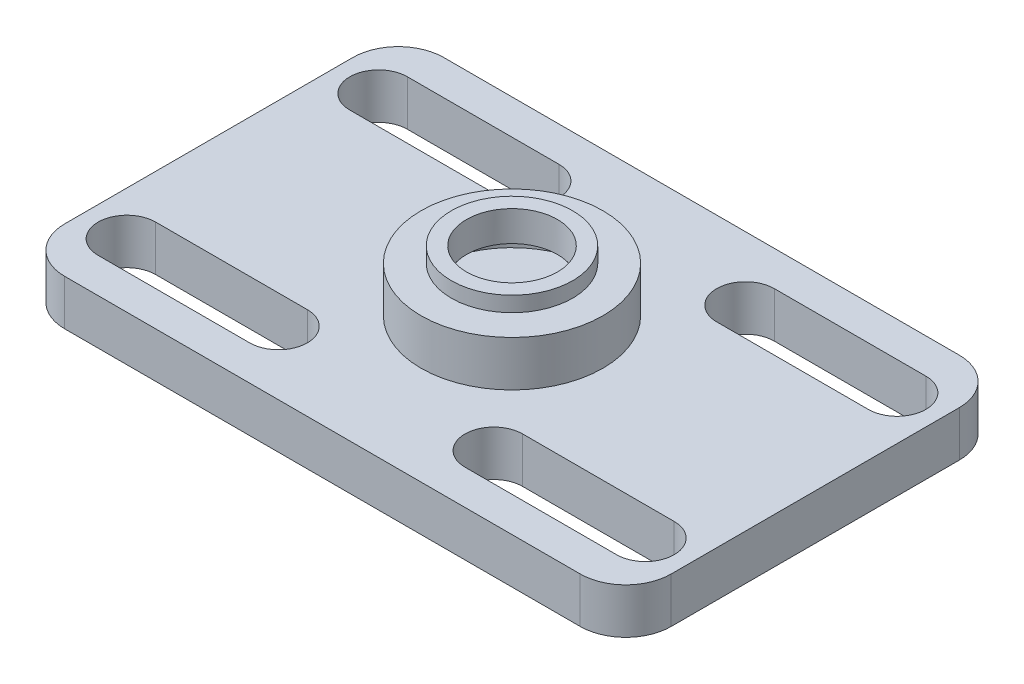
ISO-10303-21;
HEADER;
FILE_DESCRIPTION(('STEP AP214'),'2;1');
FILE_NAME('part.step','',(''),(''),'','','');
FILE_SCHEMA(('AUTOMOTIVE_DESIGN { 1 0 10303 214 1 1 1 1 }'));
ENDSEC;
DATA;
#1=APPLICATION_CONTEXT('core data for automotive mechanical design processes');
#2=APPLICATION_PROTOCOL_DEFINITION('international standard','automotive_design',2000,#1);
#3=PRODUCT_CONTEXT('',#1,'mechanical');
#4=PRODUCT('Part','Part','',(#3));
#5=PRODUCT_RELATED_PRODUCT_CATEGORY('part','',(#4));
#6=PRODUCT_DEFINITION_FORMATION('','',#4);
#7=PRODUCT_DEFINITION_CONTEXT('part definition',#1,'design');
#8=PRODUCT_DEFINITION('design','',#6,#7);
#9=PRODUCT_DEFINITION_SHAPE('','',#8);
#10=(LENGTH_UNIT() NAMED_UNIT(*) SI_UNIT(.MILLI.,.METRE.));
#11=(NAMED_UNIT(*) PLANE_ANGLE_UNIT() SI_UNIT($,.RADIAN.));
#12=(NAMED_UNIT(*) SI_UNIT($,.STERADIAN.) SOLID_ANGLE_UNIT());
#13=UNCERTAINTY_MEASURE_WITH_UNIT(LENGTH_MEASURE(1.E-05),#10,'distance_accuracy_value','');
#14=(GEOMETRIC_REPRESENTATION_CONTEXT(3) GLOBAL_UNCERTAINTY_ASSIGNED_CONTEXT((#13)) GLOBAL_UNIT_ASSIGNED_CONTEXT((#10,
#11,#12)) REPRESENTATION_CONTEXT('',''));
#15=CARTESIAN_POINT('',(0.,0.,0.));
#16=DIRECTION('',(0.,0.,1.));
#17=DIRECTION('',(1.,0.,0.));
#18=AXIS2_PLACEMENT_3D('',#15,#16,#17);
#19=CARTESIAN_POINT('',(0.,-5.,0.));
#20=DIRECTION('',(0.,1.,0.));
#21=DIRECTION('',(0.,0.,1.));
#22=AXIS2_PLACEMENT_3D('',#19,#20,#21);
#23=CYLINDRICAL_SURFACE('',#22,15.);
#24=CARTESIAN_POINT('',(0.,0.,0.));
#25=DIRECTION('',(0.,1.,0.));
#26=DIRECTION('',(0.,0.,1.));
#27=AXIS2_PLACEMENT_3D('',#24,#25,#26);
#28=CIRCLE('',#27,15.);
#29=CARTESIAN_POINT('',(0.,0.,15.));
#30=VERTEX_POINT('',#29);
#31=EDGE_CURVE('E367',#30,#30,#28,.T.);
#32=ORIENTED_EDGE('',*,*,#31,.T.);
#33=EDGE_LOOP('',(#32));
#34=FACE_BOUND('',#33,.T.);
#35=CARTESIAN_POINT('',(0.,-10.,0.));
#36=DIRECTION('',(0.,-1.,0.));
#37=DIRECTION('',(0.,0.,-1.));
#38=AXIS2_PLACEMENT_3D('',#35,#36,#37);
#39=CIRCLE('',#38,15.);
#40=CARTESIAN_POINT('',(0.,-10.,-15.));
#41=VERTEX_POINT('',#40);
#42=EDGE_CURVE('E359',#41,#41,#39,.F.);
#43=ORIENTED_EDGE('',*,*,#42,.F.);
#44=EDGE_LOOP('',(#43));
#45=FACE_BOUND('',#44,.T.);
#46=ADVANCED_FACE('F34',(#34,#45),#23,.F.);
#47=CARTESIAN_POINT('',(0.,-5.,0.));
#48=DIRECTION('',(0.,1.,0.));
#49=DIRECTION('',(0.,0.,1.));
#50=AXIS2_PLACEMENT_3D('',#47,#48,#49);
#51=CYLINDRICAL_SURFACE('',#50,20.);
#52=CARTESIAN_POINT('',(0.,-5.,0.));
#53=DIRECTION('',(0.,1.,0.));
#54=DIRECTION('',(0.,0.,1.));
#55=AXIS2_PLACEMENT_3D('',#52,#53,#54);
#56=CIRCLE('',#55,20.);
#57=CARTESIAN_POINT('',(0.,-5.,20.));
#58=VERTEX_POINT('',#57);
#59=EDGE_CURVE('E363',#58,#58,#56,.T.);
#60=ORIENTED_EDGE('',*,*,#59,.T.);
#61=EDGE_LOOP('',(#60));
#62=FACE_BOUND('',#61,.T.);
#63=CARTESIAN_POINT('',(0.,0.,0.));
#64=DIRECTION('',(0.,1.,0.));
#65=DIRECTION('',(0.,0.,1.));
#66=AXIS2_PLACEMENT_3D('',#63,#64,#65);
#67=CIRCLE('',#66,20.);
#68=CARTESIAN_POINT('',(0.,0.,20.));
#69=VERTEX_POINT('',#68);
#70=EDGE_CURVE('E370',#69,#69,#67,.T.);
#71=ORIENTED_EDGE('',*,*,#70,.F.);
#72=EDGE_LOOP('',(#71));
#73=FACE_BOUND('',#72,.T.);
#74=ADVANCED_FACE('F447',(#62,#73),#51,.T.);
#75=CARTESIAN_POINT('',(0.,0.,0.));
#76=DIRECTION('',(0.,1.,0.));
#77=DIRECTION('',(0.,0.,1.));
#78=AXIS2_PLACEMENT_3D('',#75,#76,#77);
#79=PLANE('',#78);
#80=ORIENTED_EDGE('',*,*,#31,.F.);
#81=EDGE_LOOP('',(#80));
#82=FACE_BOUND('',#81,.T.);
#83=ORIENTED_EDGE('',*,*,#70,.T.);
#84=EDGE_LOOP('',(#83));
#85=FACE_BOUND('',#84,.T.);
#86=ADVANCED_FACE('F453',(#82,#85),#79,.T.);
#87=CARTESIAN_POINT('',(0.,-5.,0.));
#88=DIRECTION('',(0.,-1.,0.));
#89=DIRECTION('',(0.,0.,-1.));
#90=AXIS2_PLACEMENT_3D('',#87,#88,#89);
#91=PLANE('',#90);
#92=ORIENTED_EDGE('',*,*,#59,.F.);
#93=EDGE_LOOP('',(#92));
#94=FACE_BOUND('',#93,.T.);
#95=CARTESIAN_POINT('',(0.,-5.,0.));
#96=DIRECTION('',(0.,-1.,0.));
#97=DIRECTION('',(0.,0.,-1.));
#98=AXIS2_PLACEMENT_3D('',#95,#96,#97);
#99=CIRCLE('',#98,30.);
#100=CARTESIAN_POINT('',(0.,-5.,-30.));
#101=VERTEX_POINT('',#100);
#102=EDGE_CURVE('E364',#101,#101,#99,.T.);
#103=ORIENTED_EDGE('',*,*,#102,.F.);
#104=EDGE_LOOP('',(#103));
#105=FACE_BOUND('',#104,.T.);
#106=ADVANCED_FACE('F462',(#94,#105),#91,.F.);
#107=CARTESIAN_POINT('',(0.,-20.,0.));
#108=DIRECTION('',(0.,1.,0.));
#109=DIRECTION('',(0.,0.,1.));
#110=AXIS2_PLACEMENT_3D('',#107,#108,#109);
#111=CYLINDRICAL_SURFACE('',#110,30.);
#112=CARTESIAN_POINT('',(0.,-20.,0.));
#113=DIRECTION('',(0.,-1.,0.));
#114=DIRECTION('',(0.,0.,-1.));
#115=AXIS2_PLACEMENT_3D('',#112,#113,#114);
#116=CIRCLE('',#115,30.);
#117=CARTESIAN_POINT('',(0.,-20.,-30.));
#118=VERTEX_POINT('',#117);
#119=EDGE_CURVE('E360',#118,#118,#116,.T.);
#120=ORIENTED_EDGE('',*,*,#119,.F.);
#121=EDGE_LOOP('',(#120));
#122=FACE_BOUND('',#121,.T.);
#123=ORIENTED_EDGE('',*,*,#102,.T.);
#124=EDGE_LOOP('',(#123));
#125=FACE_BOUND('',#124,.T.);
#126=ADVANCED_FACE('F459',(#122,#125),#111,.T.);
#127=CARTESIAN_POINT('',(0.,-10.,0.));
#128=DIRECTION('',(0.,-1.,0.));
#129=DIRECTION('',(0.,0.,-1.));
#130=AXIS2_PLACEMENT_3D('',#127,#128,#129);
#131=PLANE('',#130);
#132=CARTESIAN_POINT('',(0.,-9.99999999999999,0.));
#133=DIRECTION('',(0.,-1.,0.));
#134=DIRECTION('',(0.,0.,-1.));
#135=AXIS2_PLACEMENT_3D('',#132,#133,#134);
#136=CIRCLE('',#135,27.5);
#137=CARTESIAN_POINT('',(0.,-9.99999999999999,-27.5));
#138=VERTEX_POINT('',#137);
#139=EDGE_CURVE('E356',#138,#138,#136,.F.);
#140=ORIENTED_EDGE('',*,*,#139,.F.);
#141=EDGE_LOOP('',(#140));
#142=FACE_BOUND('',#141,.T.);
#143=ORIENTED_EDGE('',*,*,#42,.T.);
#144=EDGE_LOOP('',(#143));
#145=FACE_BOUND('',#144,.T.);
#146=ADVANCED_FACE('F489',(#142,#145),#131,.T.);
#147=CARTESIAN_POINT('',(0.,72.7817459305202,0.));
#148=DIRECTION('',(0.,-1.,0.));
#149=DIRECTION('',(0.,0.,-1.));
#150=AXIS2_PLACEMENT_3D('',#147,#148,#149);
#151=CYLINDRICAL_SURFACE('',#150,27.5);
#152=ORIENTED_EDGE('',*,*,#139,.T.);
#153=EDGE_LOOP('',(#152));
#154=FACE_BOUND('',#153,.T.);
#155=CARTESIAN_POINT('',(0.,-20.,0.));
#156=DIRECTION('',(0.,-1.,0.));
#157=DIRECTION('',(0.,0.,-1.));
#158=AXIS2_PLACEMENT_3D('',#155,#156,#157);
#159=CIRCLE('',#158,27.5);
#160=CARTESIAN_POINT('',(0.,-20.,-27.5));
#161=VERTEX_POINT('',#160);
#162=EDGE_CURVE('E344',#161,#161,#159,.T.);
#163=ORIENTED_EDGE('',*,*,#162,.T.);
#164=EDGE_LOOP('',(#163));
#165=FACE_BOUND('',#164,.T.);
#166=ADVANCED_FACE('F498',(#154,#165),#151,.F.);
#167=CARTESIAN_POINT('',(85.5000000000003,-35.,-50.9999999999993));
#168=DIRECTION('',(0.,0.,1.));
#169=DIRECTION('',(1.,0.,0.));
#170=AXIS2_PLACEMENT_3D('',#167,#168,#169);
#171=PLANE('',#170);
#172=DIRECTION('',(1.,0.,0.));
#173=VECTOR('',#172,1.);
#174=CARTESIAN_POINT('',(85.5000000000003,-20.,-50.9999999999993));
#175=LINE('',#174,#173);
#176=CARTESIAN_POINT('',(35.5000000000003,-20.,-50.9999999999998));
#177=VERTEX_POINT('',#176);
#178=CARTESIAN_POINT('',(85.5000000000003,-20.,-50.9999999999993));
#179=VERTEX_POINT('',#178);
#180=EDGE_CURVE('E209',#177,#179,#175,.T.);
#181=ORIENTED_EDGE('',*,*,#180,.F.);
#182=DIRECTION('',(0.,1.,0.));
#183=VECTOR('',#182,1.);
#184=CARTESIAN_POINT('',(35.5000000000003,-35.,-50.9999999999998));
#185=LINE('',#184,#183);
#186=CARTESIAN_POINT('',(35.5000000000003,-35.,-50.9999999999998));
#187=VERTEX_POINT('',#186);
#188=EDGE_CURVE('E237',#187,#177,#185,.T.);
#189=ORIENTED_EDGE('',*,*,#188,.F.);
#190=DIRECTION('',(1.,0.,0.));
#191=VECTOR('',#190,1.);
#192=CARTESIAN_POINT('',(85.5000000000003,-35.,-50.9999999999993));
#193=LINE('',#192,#191);
#194=CARTESIAN_POINT('',(85.5000000000003,-35.,-50.9999999999993));
#195=VERTEX_POINT('',#194);
#196=EDGE_CURVE('E224',#187,#195,#193,.T.);
#197=ORIENTED_EDGE('',*,*,#196,.T.);
#198=DIRECTION('',(0.,1.,0.));
#199=VECTOR('',#198,1.);
#200=CARTESIAN_POINT('',(85.5000000000003,-35.,-50.9999999999993));
#201=LINE('',#200,#199);
#202=EDGE_CURVE('E204',#195,#179,#201,.T.);
#203=ORIENTED_EDGE('',*,*,#202,.T.);
#204=EDGE_LOOP('',(#181,#189,#197,#203));
#205=FACE_BOUND('',#204,.T.);
#206=ADVANCED_FACE('F501',(#205),#171,.T.);
#207=CARTESIAN_POINT('',(35.5000000000003,-35.,-41.4999999999998));
#208=DIRECTION('',(0.,1.,0.));
#209=DIRECTION('',(0.,0.,1.));
#210=AXIS2_PLACEMENT_3D('',#207,#208,#209);
#211=CYLINDRICAL_SURFACE('',#210,9.49999999999997);
#212=CARTESIAN_POINT('',(35.5000000000003,-20.,-41.4999999999998));
#213=DIRECTION('',(0.,-1.,0.));
#214=DIRECTION('',(0.,0.,-1.));
#215=AXIS2_PLACEMENT_3D('',#212,#213,#214);
#216=CIRCLE('',#215,9.49999999999997);
#217=CARTESIAN_POINT('',(35.5000000000002,-20.,-31.9999999999999));
#218=VERTEX_POINT('',#217);
#219=EDGE_CURVE('E231',#218,#177,#216,.T.);
#220=ORIENTED_EDGE('',*,*,#219,.F.);
#221=DIRECTION('',(0.,1.,0.));
#222=VECTOR('',#221,1.);
#223=CARTESIAN_POINT('',(35.5000000000002,-35.,-31.9999999999999));
#224=LINE('',#223,#222);
#225=CARTESIAN_POINT('',(35.5000000000002,-35.,-31.9999999999999));
#226=VERTEX_POINT('',#225);
#227=EDGE_CURVE('E217',#226,#218,#224,.T.);
#228=ORIENTED_EDGE('',*,*,#227,.F.);
#229=CARTESIAN_POINT('',(35.5000000000003,-35.,-41.4999999999998));
#230=DIRECTION('',(0.,-1.,0.));
#231=DIRECTION('',(0.,0.,-1.));
#232=AXIS2_PLACEMENT_3D('',#229,#230,#231);
#233=CIRCLE('',#232,9.49999999999997);
#234=EDGE_CURVE('E222',#226,#187,#233,.T.);
#235=ORIENTED_EDGE('',*,*,#234,.T.);
#236=ORIENTED_EDGE('',*,*,#188,.T.);
#237=EDGE_LOOP('',(#220,#228,#235,#236));
#238=FACE_BOUND('',#237,.T.);
#239=ADVANCED_FACE('F567',(#238),#211,.F.);
#240=CARTESIAN_POINT('',(85.5000000000002,-35.,-31.9999999999994));
#241=DIRECTION('',(0.,0.,-1.));
#242=DIRECTION('',(-1.,0.,0.));
#243=AXIS2_PLACEMENT_3D('',#240,#241,#242);
#244=PLANE('',#243);
#245=DIRECTION('',(-1.,0.,0.));
#246=VECTOR('',#245,1.);
#247=CARTESIAN_POINT('',(85.5000000000002,-20.,-31.9999999999994));
#248=LINE('',#247,#246);
#249=CARTESIAN_POINT('',(85.5000000000002,-20.,-31.9999999999994));
#250=VERTEX_POINT('',#249);
#251=EDGE_CURVE('E215',#250,#218,#248,.T.);
#252=ORIENTED_EDGE('',*,*,#251,.F.);
#253=DIRECTION('',(0.,1.,0.));
#254=VECTOR('',#253,1.);
#255=CARTESIAN_POINT('',(85.5000000000002,-35.,-31.9999999999994));
#256=LINE('',#255,#254);
#257=CARTESIAN_POINT('',(85.5000000000002,-35.,-31.9999999999994));
#258=VERTEX_POINT('',#257);
#259=EDGE_CURVE('E201',#258,#250,#256,.T.);
#260=ORIENTED_EDGE('',*,*,#259,.F.);
#261=DIRECTION('',(-1.,0.,0.));
#262=VECTOR('',#261,1.);
#263=CARTESIAN_POINT('',(85.5000000000002,-35.,-31.9999999999994));
#264=LINE('',#263,#262);
#265=EDGE_CURVE('E208',#258,#226,#264,.T.);
#266=ORIENTED_EDGE('',*,*,#265,.T.);
#267=ORIENTED_EDGE('',*,*,#227,.T.);
#268=EDGE_LOOP('',(#252,#260,#266,#267));
#269=FACE_BOUND('',#268,.T.);
#270=ADVANCED_FACE('F212',(#269),#244,.T.);
#271=CARTESIAN_POINT('',(85.5000000000003,-35.,-41.4999999999994));
#272=DIRECTION('',(0.,1.,0.));
#273=DIRECTION('',(0.,0.,1.));
#274=AXIS2_PLACEMENT_3D('',#271,#272,#273);
#275=CYLINDRICAL_SURFACE('',#274,9.49999999999997);
#276=CARTESIAN_POINT('',(85.5000000000003,-20.,-41.4999999999994));
#277=DIRECTION('',(0.,-1.,0.));
#278=DIRECTION('',(0.,0.,-1.));
#279=AXIS2_PLACEMENT_3D('',#276,#277,#278);
#280=CIRCLE('',#279,9.49999999999997);
#281=EDGE_CURVE('E228',#179,#250,#280,.T.);
#282=ORIENTED_EDGE('',*,*,#281,.F.);
#283=ORIENTED_EDGE('',*,*,#202,.F.);
#284=CARTESIAN_POINT('',(85.5000000000003,-35.,-41.4999999999994));
#285=DIRECTION('',(0.,-1.,0.));
#286=DIRECTION('',(0.,0.,-1.));
#287=AXIS2_PLACEMENT_3D('',#284,#285,#286);
#288=CIRCLE('',#287,9.49999999999997);
#289=EDGE_CURVE('E198',#195,#258,#288,.T.);
#290=ORIENTED_EDGE('',*,*,#289,.T.);
#291=ORIENTED_EDGE('',*,*,#259,.T.);
#292=EDGE_LOOP('',(#282,#283,#290,#291));
#293=FACE_BOUND('',#292,.T.);
#294=ADVANCED_FACE('F200',(#293),#275,.F.);
#295=CARTESIAN_POINT('',(85.4999999999998,-35.,32.0000000000005));
#296=DIRECTION('',(0.,0.,1.));
#297=DIRECTION('',(1.,0.,0.));
#298=AXIS2_PLACEMENT_3D('',#295,#296,#297);
#299=PLANE('',#298);
#300=DIRECTION('',(1.,0.,0.));
#301=VECTOR('',#300,1.);
#302=CARTESIAN_POINT('',(85.4999999999998,-20.,32.0000000000005));
#303=LINE('',#302,#301);
#304=CARTESIAN_POINT('',(35.4999999999998,-20.,32.0000000000005));
#305=VERTEX_POINT('',#304);
#306=CARTESIAN_POINT('',(85.4999999999998,-20.,32.0000000000005));
#307=VERTEX_POINT('',#306);
#308=EDGE_CURVE('E243',#305,#307,#303,.T.);
#309=ORIENTED_EDGE('',*,*,#308,.F.);
#310=DIRECTION('',(0.,1.,0.));
#311=VECTOR('',#310,1.);
#312=CARTESIAN_POINT('',(35.4999999999998,-35.,32.0000000000005));
#313=LINE('',#312,#311);
#314=CARTESIAN_POINT('',(35.4999999999998,-35.,32.0000000000005));
#315=VERTEX_POINT('',#314);
#316=EDGE_CURVE('E263',#315,#305,#313,.T.);
#317=ORIENTED_EDGE('',*,*,#316,.F.);
#318=DIRECTION('',(1.,0.,0.));
#319=VECTOR('',#318,1.);
#320=CARTESIAN_POINT('',(85.4999999999998,-35.,32.0000000000005));
#321=LINE('',#320,#319);
#322=CARTESIAN_POINT('',(85.4999999999998,-35.,32.0000000000005));
#323=VERTEX_POINT('',#322);
#324=EDGE_CURVE('E248',#315,#323,#321,.T.);
#325=ORIENTED_EDGE('',*,*,#324,.T.);
#326=DIRECTION('',(0.,1.,0.));
#327=VECTOR('',#326,1.);
#328=CARTESIAN_POINT('',(85.4999999999998,-35.,32.0000000000005));
#329=LINE('',#328,#327);
#330=EDGE_CURVE('E250',#323,#307,#329,.T.);
#331=ORIENTED_EDGE('',*,*,#330,.T.);
#332=EDGE_LOOP('',(#309,#317,#325,#331));
#333=FACE_BOUND('',#332,.T.);
#334=ADVANCED_FACE('F558',(#333),#299,.T.);
#335=CARTESIAN_POINT('',(35.4999999999997,-35.,41.5000000000005));
#336=DIRECTION('',(0.,1.,0.));
#337=DIRECTION('',(0.,0.,1.));
#338=AXIS2_PLACEMENT_3D('',#335,#336,#337);
#339=CYLINDRICAL_SURFACE('',#338,9.49999999999997);
#340=CARTESIAN_POINT('',(35.4999999999997,-20.,41.5000000000005));
#341=DIRECTION('',(0.,-1.,0.));
#342=DIRECTION('',(0.,0.,1.));
#343=AXIS2_PLACEMENT_3D('',#340,#341,#342);
#344=CIRCLE('',#343,9.49999999999997);
#345=CARTESIAN_POINT('',(35.4999999999996,-20.,51.0000000000004));
#346=VERTEX_POINT('',#345);
#347=EDGE_CURVE('E256',#346,#305,#344,.T.);
#348=ORIENTED_EDGE('',*,*,#347,.F.);
#349=DIRECTION('',(0.,1.,0.));
#350=VECTOR('',#349,1.);
#351=CARTESIAN_POINT('',(35.4999999999996,-35.,51.0000000000004));
#352=LINE('',#351,#350);
#353=CARTESIAN_POINT('',(35.4999999999996,-35.,51.0000000000004));
#354=VERTEX_POINT('',#353);
#355=EDGE_CURVE('E265',#354,#346,#352,.T.);
#356=ORIENTED_EDGE('',*,*,#355,.F.);
#357=CARTESIAN_POINT('',(35.4999999999997,-35.,41.5000000000005));
#358=DIRECTION('',(0.,-1.,0.));
#359=DIRECTION('',(0.,0.,1.));
#360=AXIS2_PLACEMENT_3D('',#357,#358,#359);
#361=CIRCLE('',#360,9.49999999999997);
#362=EDGE_CURVE('E245',#354,#315,#361,.T.);
#363=ORIENTED_EDGE('',*,*,#362,.T.);
#364=ORIENTED_EDGE('',*,*,#316,.T.);
#365=EDGE_LOOP('',(#348,#356,#363,#364));
#366=FACE_BOUND('',#365,.T.);
#367=ADVANCED_FACE('F554',(#366),#339,.F.);
#368=CARTESIAN_POINT('',(85.4999999999996,-35.,51.0000000000004));
#369=DIRECTION('',(0.,0.,-1.));
#370=DIRECTION('',(-1.,0.,0.));
#371=AXIS2_PLACEMENT_3D('',#368,#369,#370);
#372=PLANE('',#371);
#373=DIRECTION('',(-1.,0.,0.));
#374=VECTOR('',#373,1.);
#375=CARTESIAN_POINT('',(85.4999999999996,-20.,51.0000000000004));
#376=LINE('',#375,#374);
#377=CARTESIAN_POINT('',(85.4999999999996,-20.,51.0000000000004));
#378=VERTEX_POINT('',#377);
#379=EDGE_CURVE('E253',#378,#346,#376,.T.);
#380=ORIENTED_EDGE('',*,*,#379,.F.);
#381=DIRECTION('',(0.,1.,0.));
#382=VECTOR('',#381,1.);
#383=CARTESIAN_POINT('',(85.4999999999996,-35.,51.0000000000004));
#384=LINE('',#383,#382);
#385=CARTESIAN_POINT('',(85.4999999999996,-35.,51.0000000000004));
#386=VERTEX_POINT('',#385);
#387=EDGE_CURVE('E267',#386,#378,#384,.T.);
#388=ORIENTED_EDGE('',*,*,#387,.F.);
#389=DIRECTION('',(-1.,0.,0.));
#390=VECTOR('',#389,1.);
#391=CARTESIAN_POINT('',(85.4999999999996,-35.,51.0000000000004));
#392=LINE('',#391,#390);
#393=EDGE_CURVE('E242',#386,#354,#392,.T.);
#394=ORIENTED_EDGE('',*,*,#393,.T.);
#395=ORIENTED_EDGE('',*,*,#355,.T.);
#396=EDGE_LOOP('',(#380,#388,#394,#395));
#397=FACE_BOUND('',#396,.T.);
#398=ADVANCED_FACE('F550',(#397),#372,.T.);
#399=CARTESIAN_POINT('',(85.4999999999997,-35.,41.5000000000005));
#400=DIRECTION('',(0.,1.,0.));
#401=DIRECTION('',(0.,0.,1.));
#402=AXIS2_PLACEMENT_3D('',#399,#400,#401);
#403=CYLINDRICAL_SURFACE('',#402,9.49999999999997);
#404=CARTESIAN_POINT('',(85.4999999999997,-20.,41.5000000000005));
#405=DIRECTION('',(0.,-1.,0.));
#406=DIRECTION('',(0.,0.,1.));
#407=AXIS2_PLACEMENT_3D('',#404,#405,#406);
#408=CIRCLE('',#407,9.49999999999997);
#409=EDGE_CURVE('E216',#307,#378,#408,.T.);
#410=ORIENTED_EDGE('',*,*,#409,.F.);
#411=ORIENTED_EDGE('',*,*,#330,.F.);
#412=CARTESIAN_POINT('',(85.4999999999997,-35.,41.5000000000005));
#413=DIRECTION('',(0.,-1.,0.));
#414=DIRECTION('',(0.,0.,1.));
#415=AXIS2_PLACEMENT_3D('',#412,#413,#414);
#416=CIRCLE('',#415,9.49999999999997);
#417=EDGE_CURVE('E240',#323,#386,#416,.T.);
#418=ORIENTED_EDGE('',*,*,#417,.T.);
#419=ORIENTED_EDGE('',*,*,#387,.T.);
#420=EDGE_LOOP('',(#410,#411,#418,#419));
#421=FACE_BOUND('',#420,.T.);
#422=ADVANCED_FACE('F546',(#421),#403,.F.);
#423=CARTESIAN_POINT('',(-85.5,-35.,-32.));
#424=DIRECTION('',(0.,0.,-1.));
#425=DIRECTION('',(-1.,0.,0.));
#426=AXIS2_PLACEMENT_3D('',#423,#424,#425);
#427=PLANE('',#426);
#428=DIRECTION('',(-1.,0.,0.));
#429=VECTOR('',#428,1.);
#430=CARTESIAN_POINT('',(-85.5,-20.,-32.));
#431=LINE('',#430,#429);
#432=CARTESIAN_POINT('',(-35.5,-20.,-32.0000000000001));
#433=VERTEX_POINT('',#432);
#434=CARTESIAN_POINT('',(-85.5,-20.,-32.));
#435=VERTEX_POINT('',#434);
#436=EDGE_CURVE('E274',#433,#435,#431,.T.);
#437=ORIENTED_EDGE('',*,*,#436,.F.);
#438=DIRECTION('',(0.,1.,0.));
#439=VECTOR('',#438,1.);
#440=CARTESIAN_POINT('',(-35.5,-35.,-32.0000000000001));
#441=LINE('',#440,#439);
#442=CARTESIAN_POINT('',(-35.5,-35.,-32.));
#443=VERTEX_POINT('',#442);
#444=EDGE_CURVE('E294',#443,#433,#441,.T.);
#445=ORIENTED_EDGE('',*,*,#444,.F.);
#446=DIRECTION('',(-1.,0.,0.));
#447=VECTOR('',#446,1.);
#448=CARTESIAN_POINT('',(-85.5,-35.,-32.));
#449=LINE('',#448,#447);
#450=CARTESIAN_POINT('',(-85.5,-35.,-32.));
#451=VERTEX_POINT('',#450);
#452=EDGE_CURVE('E279',#443,#451,#449,.T.);
#453=ORIENTED_EDGE('',*,*,#452,.T.);
#454=DIRECTION('',(0.,1.,0.));
#455=VECTOR('',#454,1.);
#456=CARTESIAN_POINT('',(-85.5,-35.,-32.));
#457=LINE('',#456,#455);
#458=EDGE_CURVE('E281',#451,#435,#457,.T.);
#459=ORIENTED_EDGE('',*,*,#458,.T.);
#460=EDGE_LOOP('',(#437,#445,#453,#459));
#461=FACE_BOUND('',#460,.T.);
#462=ADVANCED_FACE('F542',(#461),#427,.T.);
#463=CARTESIAN_POINT('',(-35.5,-35.,-41.5));
#464=DIRECTION('',(0.,1.,0.));
#465=DIRECTION('',(0.,0.,1.));
#466=AXIS2_PLACEMENT_3D('',#463,#464,#465);
#467=CYLINDRICAL_SURFACE('',#466,9.49999999999997);
#468=CARTESIAN_POINT('',(-35.5,-20.,-41.5));
#469=DIRECTION('',(0.,-1.,0.));
#470=DIRECTION('',(0.,0.,1.));
#471=AXIS2_PLACEMENT_3D('',#468,#469,#470);
#472=CIRCLE('',#471,9.49999999999997);
#473=CARTESIAN_POINT('',(-35.5,-20.,-51.));
#474=VERTEX_POINT('',#473);
#475=EDGE_CURVE('E287',#474,#433,#472,.T.);
#476=ORIENTED_EDGE('',*,*,#475,.F.);
#477=DIRECTION('',(0.,1.,0.));
#478=VECTOR('',#477,1.);
#479=CARTESIAN_POINT('',(-35.5,-35.,-51.));
#480=LINE('',#479,#478);
#481=CARTESIAN_POINT('',(-35.5,-35.,-51.));
#482=VERTEX_POINT('',#481);
#483=EDGE_CURVE('E296',#482,#474,#480,.T.);
#484=ORIENTED_EDGE('',*,*,#483,.F.);
#485=CARTESIAN_POINT('',(-35.5,-35.,-41.5));
#486=DIRECTION('',(0.,-1.,0.));
#487=DIRECTION('',(0.,0.,1.));
#488=AXIS2_PLACEMENT_3D('',#485,#486,#487);
#489=CIRCLE('',#488,9.49999999999997);
#490=EDGE_CURVE('E276',#482,#443,#489,.T.);
#491=ORIENTED_EDGE('',*,*,#490,.T.);
#492=ORIENTED_EDGE('',*,*,#444,.T.);
#493=EDGE_LOOP('',(#476,#484,#491,#492));
#494=FACE_BOUND('',#493,.T.);
#495=ADVANCED_FACE('F538',(#494),#467,.F.);
#496=CARTESIAN_POINT('',(-85.5,-35.,-51.));
#497=DIRECTION('',(0.,0.,1.));
#498=DIRECTION('',(1.,0.,0.));
#499=AXIS2_PLACEMENT_3D('',#496,#497,#498);
#500=PLANE('',#499);
#501=DIRECTION('',(1.,0.,0.));
#502=VECTOR('',#501,1.);
#503=CARTESIAN_POINT('',(-85.5,-20.,-51.));
#504=LINE('',#503,#502);
#505=CARTESIAN_POINT('',(-85.5,-20.,-51.));
#506=VERTEX_POINT('',#505);
#507=EDGE_CURVE('E284',#506,#474,#504,.T.);
#508=ORIENTED_EDGE('',*,*,#507,.F.);
#509=DIRECTION('',(0.,1.,0.));
#510=VECTOR('',#509,1.);
#511=CARTESIAN_POINT('',(-85.5,-35.,-51.));
#512=LINE('',#511,#510);
#513=CARTESIAN_POINT('',(-85.5,-35.,-51.));
#514=VERTEX_POINT('',#513);
#515=EDGE_CURVE('E298',#514,#506,#512,.T.);
#516=ORIENTED_EDGE('',*,*,#515,.F.);
#517=DIRECTION('',(1.,0.,0.));
#518=VECTOR('',#517,1.);
#519=CARTESIAN_POINT('',(-85.5,-35.,-51.));
#520=LINE('',#519,#518);
#521=EDGE_CURVE('E273',#514,#482,#520,.T.);
#522=ORIENTED_EDGE('',*,*,#521,.T.);
#523=ORIENTED_EDGE('',*,*,#483,.T.);
#524=EDGE_LOOP('',(#508,#516,#522,#523));
#525=FACE_BOUND('',#524,.T.);
#526=ADVANCED_FACE('F534',(#525),#500,.T.);
#527=CARTESIAN_POINT('',(-85.5,-35.,-41.5));
#528=DIRECTION('',(0.,1.,0.));
#529=DIRECTION('',(0.,0.,1.));
#530=AXIS2_PLACEMENT_3D('',#527,#528,#529);
#531=CYLINDRICAL_SURFACE('',#530,9.49999999999997);
#532=CARTESIAN_POINT('',(-85.5,-20.,-41.5));
#533=DIRECTION('',(0.,-1.,0.));
#534=DIRECTION('',(0.,0.,1.));
#535=AXIS2_PLACEMENT_3D('',#532,#533,#534);
#536=CIRCLE('',#535,9.49999999999997);
#537=EDGE_CURVE('E270',#435,#506,#536,.T.);
#538=ORIENTED_EDGE('',*,*,#537,.F.);
#539=ORIENTED_EDGE('',*,*,#458,.F.);
#540=CARTESIAN_POINT('',(-85.5,-35.,-41.5));
#541=DIRECTION('',(0.,-1.,0.));
#542=DIRECTION('',(0.,0.,1.));
#543=AXIS2_PLACEMENT_3D('',#540,#541,#542);
#544=CIRCLE('',#543,9.49999999999997);
#545=EDGE_CURVE('E271',#451,#514,#544,.T.);
#546=ORIENTED_EDGE('',*,*,#545,.T.);
#547=ORIENTED_EDGE('',*,*,#515,.T.);
#548=EDGE_LOOP('',(#538,#539,#546,#547));
#549=FACE_BOUND('',#548,.T.);
#550=ADVANCED_FACE('F530',(#549),#531,.F.);
#551=CARTESIAN_POINT('',(-85.5,-35.,51.));
#552=DIRECTION('',(0.,0.,-1.));
#553=DIRECTION('',(-1.,0.,0.));
#554=AXIS2_PLACEMENT_3D('',#551,#552,#553);
#555=PLANE('',#554);
#556=DIRECTION('',(-1.,0.,0.));
#557=VECTOR('',#556,1.);
#558=CARTESIAN_POINT('',(-85.5,-20.,51.));
#559=LINE('',#558,#557);
#560=CARTESIAN_POINT('',(-35.5,-20.,51.));
#561=VERTEX_POINT('',#560);
#562=CARTESIAN_POINT('',(-85.5,-20.,51.));
#563=VERTEX_POINT('',#562);
#564=EDGE_CURVE('E305',#561,#563,#559,.T.);
#565=ORIENTED_EDGE('',*,*,#564,.F.);
#566=DIRECTION('',(0.,1.,0.));
#567=VECTOR('',#566,1.);
#568=CARTESIAN_POINT('',(-35.5,-35.,51.));
#569=LINE('',#568,#567);
#570=CARTESIAN_POINT('',(-35.5,-35.,51.));
#571=VERTEX_POINT('',#570);
#572=EDGE_CURVE('E325',#571,#561,#569,.T.);
#573=ORIENTED_EDGE('',*,*,#572,.F.);
#574=DIRECTION('',(-1.,0.,0.));
#575=VECTOR('',#574,1.);
#576=CARTESIAN_POINT('',(-85.5,-35.,51.));
#577=LINE('',#576,#575);
#578=CARTESIAN_POINT('',(-85.5,-35.,51.));
#579=VERTEX_POINT('',#578);
#580=EDGE_CURVE('E310',#571,#579,#577,.T.);
#581=ORIENTED_EDGE('',*,*,#580,.T.);
#582=DIRECTION('',(0.,1.,0.));
#583=VECTOR('',#582,1.);
#584=CARTESIAN_POINT('',(-85.5,-35.,51.));
#585=LINE('',#584,#583);
#586=EDGE_CURVE('E312',#579,#563,#585,.T.);
#587=ORIENTED_EDGE('',*,*,#586,.T.);
#588=EDGE_LOOP('',(#565,#573,#581,#587));
#589=FACE_BOUND('',#588,.T.);
#590=ADVANCED_FACE('F526',(#589),#555,.T.);
#591=CARTESIAN_POINT('',(-35.5,-35.,41.5));
#592=DIRECTION('',(0.,1.,0.));
#593=DIRECTION('',(0.,0.,1.));
#594=AXIS2_PLACEMENT_3D('',#591,#592,#593);
#595=CYLINDRICAL_SURFACE('',#594,9.49999999999997);
#596=CARTESIAN_POINT('',(-35.5,-20.,41.5));
#597=DIRECTION('',(0.,-1.,0.));
#598=DIRECTION('',(0.,0.,-1.));
#599=AXIS2_PLACEMENT_3D('',#596,#597,#598);
#600=CIRCLE('',#599,9.49999999999997);
#601=CARTESIAN_POINT('',(-35.5,-20.,32.));
#602=VERTEX_POINT('',#601);
#603=EDGE_CURVE('E318',#602,#561,#600,.T.);
#604=ORIENTED_EDGE('',*,*,#603,.F.);
#605=DIRECTION('',(0.,1.,0.));
#606=VECTOR('',#605,1.);
#607=CARTESIAN_POINT('',(-35.5,-35.,32.));
#608=LINE('',#607,#606);
#609=CARTESIAN_POINT('',(-35.5,-35.,32.));
#610=VERTEX_POINT('',#609);
#611=EDGE_CURVE('E327',#610,#602,#608,.T.);
#612=ORIENTED_EDGE('',*,*,#611,.F.);
#613=CARTESIAN_POINT('',(-35.5,-35.,41.5));
#614=DIRECTION('',(0.,-1.,0.));
#615=DIRECTION('',(0.,0.,-1.));
#616=AXIS2_PLACEMENT_3D('',#613,#614,#615);
#617=CIRCLE('',#616,9.49999999999997);
#618=EDGE_CURVE('E307',#610,#571,#617,.T.);
#619=ORIENTED_EDGE('',*,*,#618,.T.);
#620=ORIENTED_EDGE('',*,*,#572,.T.);
#621=EDGE_LOOP('',(#604,#612,#619,#620));
#622=FACE_BOUND('',#621,.T.);
#623=ADVANCED_FACE('F520',(#622),#595,.F.);
#624=CARTESIAN_POINT('',(-85.5,-35.,32.));
#625=DIRECTION('',(0.,0.,1.));
#626=DIRECTION('',(1.,0.,0.));
#627=AXIS2_PLACEMENT_3D('',#624,#625,#626);
#628=PLANE('',#627);
#629=DIRECTION('',(1.,0.,0.));
#630=VECTOR('',#629,1.);
#631=CARTESIAN_POINT('',(-85.5,-20.,32.));
#632=LINE('',#631,#630);
#633=CARTESIAN_POINT('',(-85.5,-20.,32.));
#634=VERTEX_POINT('',#633);
#635=EDGE_CURVE('E315',#634,#602,#632,.T.);
#636=ORIENTED_EDGE('',*,*,#635,.F.);
#637=DIRECTION('',(0.,1.,0.));
#638=VECTOR('',#637,1.);
#639=CARTESIAN_POINT('',(-85.5,-35.,32.));
#640=LINE('',#639,#638);
#641=CARTESIAN_POINT('',(-85.5,-35.,32.));
#642=VERTEX_POINT('',#641);
#643=EDGE_CURVE('E329',#642,#634,#640,.T.);
#644=ORIENTED_EDGE('',*,*,#643,.F.);
#645=DIRECTION('',(1.,0.,0.));
#646=VECTOR('',#645,1.);
#647=CARTESIAN_POINT('',(-85.5,-35.,32.));
#648=LINE('',#647,#646);
#649=EDGE_CURVE('E304',#642,#610,#648,.T.);
#650=ORIENTED_EDGE('',*,*,#649,.T.);
#651=ORIENTED_EDGE('',*,*,#611,.T.);
#652=EDGE_LOOP('',(#636,#644,#650,#651));
#653=FACE_BOUND('',#652,.T.);
#654=ADVANCED_FACE('F514',(#653),#628,.T.);
#655=CARTESIAN_POINT('',(-85.5,-35.,41.5));
#656=DIRECTION('',(0.,1.,0.));
#657=DIRECTION('',(0.,0.,1.));
#658=AXIS2_PLACEMENT_3D('',#655,#656,#657);
#659=CYLINDRICAL_SURFACE('',#658,9.49999999999997);
#660=CARTESIAN_POINT('',(-85.5,-20.,41.5));
#661=DIRECTION('',(0.,-1.,0.));
#662=DIRECTION('',(0.,0.,-1.));
#663=AXIS2_PLACEMENT_3D('',#660,#661,#662);
#664=CIRCLE('',#663,9.49999999999997);
#665=EDGE_CURVE('E301',#563,#634,#664,.T.);
#666=ORIENTED_EDGE('',*,*,#665,.F.);
#667=ORIENTED_EDGE('',*,*,#586,.F.);
#668=CARTESIAN_POINT('',(-85.5,-35.,41.5));
#669=DIRECTION('',(0.,-1.,0.));
#670=DIRECTION('',(0.,0.,-1.));
#671=AXIS2_PLACEMENT_3D('',#668,#669,#670);
#672=CIRCLE('',#671,9.49999999999997);
#673=EDGE_CURVE('E302',#579,#642,#672,.T.);
#674=ORIENTED_EDGE('',*,*,#673,.T.);
#675=ORIENTED_EDGE('',*,*,#643,.T.);
#676=EDGE_LOOP('',(#666,#667,#674,#675));
#677=FACE_BOUND('',#676,.T.);
#678=ADVANCED_FACE('F510',(#677),#659,.F.);
#679=CARTESIAN_POINT('',(100.,-35.,62.5));
#680=DIRECTION('',(-1.,0.,0.));
#681=DIRECTION('',(0.,0.,1.));
#682=AXIS2_PLACEMENT_3D('',#679,#680,#681);
#683=PLANE('',#682);
#684=DIRECTION('',(0.,0.,1.));
#685=VECTOR('',#684,1.);
#686=CARTESIAN_POINT('',(100.,-20.,62.5));
#687=LINE('',#686,#685);
#688=CARTESIAN_POINT('',(100.,-20.,-47.5));
#689=VERTEX_POINT('',#688);
#690=CARTESIAN_POINT('',(100.,-20.,47.5));
#691=VERTEX_POINT('',#690);
#692=EDGE_CURVE('E337',#689,#691,#687,.T.);
#693=ORIENTED_EDGE('',*,*,#692,.T.);
#694=DIRECTION('',(0.,1.,0.));
#695=VECTOR('',#694,1.);
#696=CARTESIAN_POINT('',(100.,-35.,47.5));
#697=LINE('',#696,#695);
#698=CARTESIAN_POINT('',(100.,-35.,47.5));
#699=VERTEX_POINT('',#698);
#700=EDGE_CURVE('E393',#691,#699,#697,.F.);
#701=ORIENTED_EDGE('',*,*,#700,.T.);
#702=DIRECTION('',(0.,0.,1.));
#703=VECTOR('',#702,1.);
#704=CARTESIAN_POINT('',(100.,-35.,62.5));
#705=LINE('',#704,#703);
#706=CARTESIAN_POINT('',(100.,-35.,-47.5));
#707=VERTEX_POINT('',#706);
#708=EDGE_CURVE('E341',#707,#699,#705,.T.);
#709=ORIENTED_EDGE('',*,*,#708,.F.);
#710=DIRECTION('',(0.,1.,0.));
#711=VECTOR('',#710,1.);
#712=CARTESIAN_POINT('',(100.,-35.,-47.5));
#713=LINE('',#712,#711);
#714=EDGE_CURVE('E390',#707,#689,#713,.T.);
#715=ORIENTED_EDGE('',*,*,#714,.T.);
#716=EDGE_LOOP('',(#693,#701,#709,#715));
#717=FACE_BOUND('',#716,.T.);
#718=ADVANCED_FACE('F428',(#717),#683,.F.);
#719=CARTESIAN_POINT('',(-100.,-35.,-62.5));
#720=DIRECTION('',(0.,0.,1.));
#721=DIRECTION('',(1.,0.,0.));
#722=AXIS2_PLACEMENT_3D('',#719,#720,#721);
#723=PLANE('',#722);
#724=DIRECTION('',(1.,0.,0.));
#725=VECTOR('',#724,1.);
#726=CARTESIAN_POINT('',(-100.,-20.,-62.5));
#727=LINE('',#726,#725);
#728=CARTESIAN_POINT('',(-85.,-20.,-62.5));
#729=VERTEX_POINT('',#728);
#730=CARTESIAN_POINT('',(85.,-20.,-62.5));
#731=VERTEX_POINT('',#730);
#732=EDGE_CURVE('E350',#729,#731,#727,.T.);
#733=ORIENTED_EDGE('',*,*,#732,.T.);
#734=DIRECTION('',(0.,1.,0.));
#735=VECTOR('',#734,1.);
#736=CARTESIAN_POINT('',(85.,-35.,-62.5));
#737=LINE('',#736,#735);
#738=CARTESIAN_POINT('',(85.,-35.,-62.5));
#739=VERTEX_POINT('',#738);
#740=EDGE_CURVE('E49',#731,#739,#737,.F.);
#741=ORIENTED_EDGE('',*,*,#740,.T.);
#742=DIRECTION('',(1.,0.,0.));
#743=VECTOR('',#742,1.);
#744=CARTESIAN_POINT('',(-100.,-35.,-62.5));
#745=LINE('',#744,#743);
#746=CARTESIAN_POINT('',(-85.,-35.,-62.5));
#747=VERTEX_POINT('',#746);
#748=EDGE_CURVE('E339',#747,#739,#745,.T.);
#749=ORIENTED_EDGE('',*,*,#748,.F.);
#750=DIRECTION('',(0.,1.,0.));
#751=VECTOR('',#750,1.);
#752=CARTESIAN_POINT('',(-85.,-35.,-62.5));
#753=LINE('',#752,#751);
#754=EDGE_CURVE('E402',#747,#729,#753,.T.);
#755=ORIENTED_EDGE('',*,*,#754,.T.);
#756=EDGE_LOOP('',(#733,#741,#749,#755));
#757=FACE_BOUND('',#756,.T.);
#758=ADVANCED_FACE('F416',(#757),#723,.F.);
#759=CARTESIAN_POINT('',(-100.,-35.,62.5));
#760=DIRECTION('',(1.,0.,0.));
#761=DIRECTION('',(0.,0.,-1.));
#762=AXIS2_PLACEMENT_3D('',#759,#760,#761);
#763=PLANE('',#762);
#764=DIRECTION('',(0.,0.,-1.));
#765=VECTOR('',#764,1.);
#766=CARTESIAN_POINT('',(-100.,-35.,62.5));
#767=LINE('',#766,#765);
#768=CARTESIAN_POINT('',(-100.,-35.,47.5));
#769=VERTEX_POINT('',#768);
#770=CARTESIAN_POINT('',(-100.,-35.,-47.5));
#771=VERTEX_POINT('',#770);
#772=EDGE_CURVE('E336',#769,#771,#767,.T.);
#773=ORIENTED_EDGE('',*,*,#772,.F.);
#774=DIRECTION('',(0.,1.,0.));
#775=VECTOR('',#774,1.);
#776=CARTESIAN_POINT('',(-100.,-35.,47.5));
#777=LINE('',#776,#775);
#778=CARTESIAN_POINT('',(-100.,-20.,47.5));
#779=VERTEX_POINT('',#778);
#780=EDGE_CURVE('E12',#769,#779,#777,.T.);
#781=ORIENTED_EDGE('',*,*,#780,.T.);
#782=DIRECTION('',(0.,0.,-1.));
#783=VECTOR('',#782,1.);
#784=CARTESIAN_POINT('',(-100.,-20.,62.5));
#785=LINE('',#784,#783);
#786=CARTESIAN_POINT('',(-100.,-20.,-47.5));
#787=VERTEX_POINT('',#786);
#788=EDGE_CURVE('E347',#779,#787,#785,.T.);
#789=ORIENTED_EDGE('',*,*,#788,.T.);
#790=DIRECTION('',(0.,1.,0.));
#791=VECTOR('',#790,1.);
#792=CARTESIAN_POINT('',(-100.,-35.,-47.5));
#793=LINE('',#792,#791);
#794=EDGE_CURVE('E42',#787,#771,#793,.F.);
#795=ORIENTED_EDGE('',*,*,#794,.T.);
#796=EDGE_LOOP('',(#773,#781,#789,#795));
#797=FACE_BOUND('',#796,.T.);
#798=ADVANCED_FACE('F408',(#797),#763,.F.);
#799=CARTESIAN_POINT('',(-100.,-35.,62.5));
#800=DIRECTION('',(0.,0.,-1.));
#801=DIRECTION('',(-1.,0.,0.));
#802=AXIS2_PLACEMENT_3D('',#799,#800,#801);
#803=PLANE('',#802);
#804=DIRECTION('',(-1.,0.,0.));
#805=VECTOR('',#804,1.);
#806=CARTESIAN_POINT('',(-100.,-35.,62.5));
#807=LINE('',#806,#805);
#808=CARTESIAN_POINT('',(85.,-35.,62.5));
#809=VERTEX_POINT('',#808);
#810=CARTESIAN_POINT('',(-85.,-35.,62.5));
#811=VERTEX_POINT('',#810);
#812=EDGE_CURVE('E333',#809,#811,#807,.T.);
#813=ORIENTED_EDGE('',*,*,#812,.F.);
#814=DIRECTION('',(0.,1.,0.));
#815=VECTOR('',#814,1.);
#816=CARTESIAN_POINT('',(85.,-35.,62.5));
#817=LINE('',#816,#815);
#818=CARTESIAN_POINT('',(85.,-20.,62.5));
#819=VERTEX_POINT('',#818);
#820=EDGE_CURVE('E379',#809,#819,#817,.T.);
#821=ORIENTED_EDGE('',*,*,#820,.T.);
#822=DIRECTION('',(-1.,0.,0.));
#823=VECTOR('',#822,1.);
#824=CARTESIAN_POINT('',(-100.,-20.,62.5));
#825=LINE('',#824,#823);
#826=CARTESIAN_POINT('',(-85.,-20.,62.5));
#827=VERTEX_POINT('',#826);
#828=EDGE_CURVE('E332',#819,#827,#825,.T.);
#829=ORIENTED_EDGE('',*,*,#828,.T.);
#830=DIRECTION('',(0.,1.,0.));
#831=VECTOR('',#830,1.);
#832=CARTESIAN_POINT('',(-85.,-35.,62.5));
#833=LINE('',#832,#831);
#834=EDGE_CURVE('E375',#827,#811,#833,.F.);
#835=ORIENTED_EDGE('',*,*,#834,.T.);
#836=EDGE_LOOP('',(#813,#821,#829,#835));
#837=FACE_BOUND('',#836,.T.);
#838=ADVANCED_FACE('F436',(#837),#803,.F.);
#839=CARTESIAN_POINT('',(0.,-20.,0.));
#840=DIRECTION('',(0.,1.,0.));
#841=DIRECTION('',(0.,0.,1.));
#842=AXIS2_PLACEMENT_3D('',#839,#840,#841);
#843=PLANE('',#842);
#844=ORIENTED_EDGE('',*,*,#119,.T.);
#845=EDGE_LOOP('',(#844));
#846=FACE_BOUND('',#845,.T.);
#847=ORIENTED_EDGE('',*,*,#828,.F.);
#848=CARTESIAN_POINT('',(85.,-20.,47.5));
#849=DIRECTION('',(0.,1.,0.));
#850=DIRECTION('',(0.,0.,1.));
#851=AXIS2_PLACEMENT_3D('',#848,#849,#850);
#852=CIRCLE('',#851,15.);
#853=EDGE_CURVE('E388',#819,#691,#852,.T.);
#854=ORIENTED_EDGE('',*,*,#853,.T.);
#855=ORIENTED_EDGE('',*,*,#692,.F.);
#856=CARTESIAN_POINT('',(85.,-20.,-47.5));
#857=DIRECTION('',(0.,1.,0.));
#858=DIRECTION('',(0.,0.,1.));
#859=AXIS2_PLACEMENT_3D('',#856,#857,#858);
#860=CIRCLE('',#859,15.);
#861=EDGE_CURVE('E386',#689,#731,#860,.T.);
#862=ORIENTED_EDGE('',*,*,#861,.T.);
#863=ORIENTED_EDGE('',*,*,#732,.F.);
#864=CARTESIAN_POINT('',(-85.,-20.,-47.5));
#865=DIRECTION('',(0.,1.,0.));
#866=DIRECTION('',(0.,0.,1.));
#867=AXIS2_PLACEMENT_3D('',#864,#865,#866);
#868=CIRCLE('',#867,15.);
#869=EDGE_CURVE('E382',#729,#787,#868,.T.);
#870=ORIENTED_EDGE('',*,*,#869,.T.);
#871=ORIENTED_EDGE('',*,*,#788,.F.);
#872=CARTESIAN_POINT('',(-85.,-20.,47.5));
#873=DIRECTION('',(0.,1.,0.));
#874=DIRECTION('',(0.,0.,1.));
#875=AXIS2_PLACEMENT_3D('',#872,#873,#874);
#876=CIRCLE('',#875,15.);
#877=EDGE_CURVE('E384',#779,#827,#876,.T.);
#878=ORIENTED_EDGE('',*,*,#877,.T.);
#879=EDGE_LOOP('',(#847,#854,#855,#862,#863,#870,#871,#878));
#880=FACE_BOUND('',#879,.T.);
#881=ORIENTED_EDGE('',*,*,#564,.T.);
#882=ORIENTED_EDGE('',*,*,#665,.T.);
#883=ORIENTED_EDGE('',*,*,#635,.T.);
#884=ORIENTED_EDGE('',*,*,#603,.T.);
#885=EDGE_LOOP('',(#881,#882,#883,#884));
#886=FACE_BOUND('',#885,.T.);
#887=ORIENTED_EDGE('',*,*,#436,.T.);
#888=ORIENTED_EDGE('',*,*,#537,.T.);
#889=ORIENTED_EDGE('',*,*,#507,.T.);
#890=ORIENTED_EDGE('',*,*,#475,.T.);
#891=EDGE_LOOP('',(#887,#888,#889,#890));
#892=FACE_BOUND('',#891,.T.);
#893=ORIENTED_EDGE('',*,*,#308,.T.);
#894=ORIENTED_EDGE('',*,*,#409,.T.);
#895=ORIENTED_EDGE('',*,*,#379,.T.);
#896=ORIENTED_EDGE('',*,*,#347,.T.);
#897=EDGE_LOOP('',(#893,#894,#895,#896));
#898=FACE_BOUND('',#897,.T.);
#899=ORIENTED_EDGE('',*,*,#180,.T.);
#900=ORIENTED_EDGE('',*,*,#281,.T.);
#901=ORIENTED_EDGE('',*,*,#251,.T.);
#902=ORIENTED_EDGE('',*,*,#219,.T.);
#903=EDGE_LOOP('',(#899,#900,#901,#902));
#904=FACE_BOUND('',#903,.T.);
#905=ADVANCED_FACE('F419',(#846,#880,#886,#892,#898,#904),#843,.T.);
#906=CARTESIAN_POINT('',(0.,-35.,0.));
#907=DIRECTION('',(0.,1.,0.));
#908=DIRECTION('',(0.,0.,1.));
#909=AXIS2_PLACEMENT_3D('',#906,#907,#908);
#910=PLANE('',#909);
#911=ORIENTED_EDGE('',*,*,#417,.F.);
#912=ORIENTED_EDGE('',*,*,#324,.F.);
#913=ORIENTED_EDGE('',*,*,#362,.F.);
#914=ORIENTED_EDGE('',*,*,#393,.F.);
#915=EDGE_LOOP('',(#911,#912,#913,#914));
#916=FACE_BOUND('',#915,.T.);
#917=ORIENTED_EDGE('',*,*,#673,.F.);
#918=ORIENTED_EDGE('',*,*,#580,.F.);
#919=ORIENTED_EDGE('',*,*,#618,.F.);
#920=ORIENTED_EDGE('',*,*,#649,.F.);
#921=EDGE_LOOP('',(#917,#918,#919,#920));
#922=FACE_BOUND('',#921,.T.);
#923=ORIENTED_EDGE('',*,*,#708,.T.);
#924=CARTESIAN_POINT('',(85.,-35.,47.5));
#925=DIRECTION('',(0.,1.,0.));
#926=DIRECTION('',(0.,0.,1.));
#927=AXIS2_PLACEMENT_3D('',#924,#925,#926);
#928=CIRCLE('',#927,15.);
#929=EDGE_CURVE('E400',#699,#809,#928,.F.);
#930=ORIENTED_EDGE('',*,*,#929,.T.);
#931=ORIENTED_EDGE('',*,*,#812,.T.);
#932=CARTESIAN_POINT('',(-85.,-35.,47.5));
#933=DIRECTION('',(0.,1.,0.));
#934=DIRECTION('',(0.,0.,1.));
#935=AXIS2_PLACEMENT_3D('',#932,#933,#934);
#936=CIRCLE('',#935,15.);
#937=EDGE_CURVE('E396',#811,#769,#936,.F.);
#938=ORIENTED_EDGE('',*,*,#937,.T.);
#939=ORIENTED_EDGE('',*,*,#772,.T.);
#940=CARTESIAN_POINT('',(-85.,-35.,-47.5));
#941=DIRECTION('',(0.,1.,0.));
#942=DIRECTION('',(0.,0.,1.));
#943=AXIS2_PLACEMENT_3D('',#940,#941,#942);
#944=CIRCLE('',#943,15.);
#945=EDGE_CURVE('E56',#771,#747,#944,.F.);
#946=ORIENTED_EDGE('',*,*,#945,.T.);
#947=ORIENTED_EDGE('',*,*,#748,.T.);
#948=CARTESIAN_POINT('',(85.,-35.,-47.5));
#949=DIRECTION('',(0.,1.,0.));
#950=DIRECTION('',(0.,0.,1.));
#951=AXIS2_PLACEMENT_3D('',#948,#949,#950);
#952=CIRCLE('',#951,15.);
#953=EDGE_CURVE('E398',#739,#707,#952,.F.);
#954=ORIENTED_EDGE('',*,*,#953,.T.);
#955=EDGE_LOOP('',(#923,#930,#931,#938,#939,#946,#947,#954));
#956=FACE_BOUND('',#955,.T.);
#957=ORIENTED_EDGE('',*,*,#545,.F.);
#958=ORIENTED_EDGE('',*,*,#452,.F.);
#959=ORIENTED_EDGE('',*,*,#490,.F.);
#960=ORIENTED_EDGE('',*,*,#521,.F.);
#961=EDGE_LOOP('',(#957,#958,#959,#960));
#962=FACE_BOUND('',#961,.T.);
#963=ORIENTED_EDGE('',*,*,#289,.F.);
#964=ORIENTED_EDGE('',*,*,#196,.F.);
#965=ORIENTED_EDGE('',*,*,#234,.F.);
#966=ORIENTED_EDGE('',*,*,#265,.F.);
#967=EDGE_LOOP('',(#963,#964,#965,#966));
#968=FACE_BOUND('',#967,.T.);
#969=ADVANCED_FACE('F220',(#916,#922,#956,#962,#968),#910,.F.);
#970=ORIENTED_EDGE('',*,*,#162,.F.);
#971=EDGE_LOOP('',(#970));
#972=FACE_BOUND('',#971,.T.);
#973=ADVANCED_FACE('F466',(#972),#843,.T.);
#974=CARTESIAN_POINT('',(85.,-35.,47.5));
#975=DIRECTION('',(0.,1.,0.));
#976=DIRECTION('',(0.,0.,1.));
#977=AXIS2_PLACEMENT_3D('',#974,#975,#976);
#978=CYLINDRICAL_SURFACE('',#977,15.);
#979=ORIENTED_EDGE('',*,*,#929,.F.);
#980=ORIENTED_EDGE('',*,*,#700,.F.);
#981=ORIENTED_EDGE('',*,*,#853,.F.);
#982=ORIENTED_EDGE('',*,*,#820,.F.);
#983=EDGE_LOOP('',(#979,#980,#981,#982));
#984=FACE_BOUND('',#983,.T.);
#985=ADVANCED_FACE('F434',(#984),#978,.T.);
#986=CARTESIAN_POINT('',(85.,-35.,-47.5));
#987=DIRECTION('',(0.,1.,0.));
#988=DIRECTION('',(0.,0.,1.));
#989=AXIS2_PLACEMENT_3D('',#986,#987,#988);
#990=CYLINDRICAL_SURFACE('',#989,15.);
#991=ORIENTED_EDGE('',*,*,#953,.F.);
#992=ORIENTED_EDGE('',*,*,#740,.F.);
#993=ORIENTED_EDGE('',*,*,#861,.F.);
#994=ORIENTED_EDGE('',*,*,#714,.F.);
#995=EDGE_LOOP('',(#991,#992,#993,#994));
#996=FACE_BOUND('',#995,.T.);
#997=ADVANCED_FACE('F425',(#996),#990,.T.);
#998=CARTESIAN_POINT('',(-85.,-35.,47.5));
#999=DIRECTION('',(0.,1.,0.));
#1000=DIRECTION('',(0.,0.,1.));
#1001=AXIS2_PLACEMENT_3D('',#998,#999,#1000);
#1002=CYLINDRICAL_SURFACE('',#1001,15.);
#1003=ORIENTED_EDGE('',*,*,#937,.F.);
#1004=ORIENTED_EDGE('',*,*,#834,.F.);
#1005=ORIENTED_EDGE('',*,*,#877,.F.);
#1006=ORIENTED_EDGE('',*,*,#780,.F.);
#1007=EDGE_LOOP('',(#1003,#1004,#1005,#1006));
#1008=FACE_BOUND('',#1007,.T.);
#1009=ADVANCED_FACE('F439',(#1008),#1002,.T.);
#1010=CARTESIAN_POINT('',(-85.,-35.,-47.5));
#1011=DIRECTION('',(0.,1.,0.));
#1012=DIRECTION('',(0.,0.,1.));
#1013=AXIS2_PLACEMENT_3D('',#1010,#1011,#1012);
#1014=CYLINDRICAL_SURFACE('',#1013,15.);
#1015=ORIENTED_EDGE('',*,*,#945,.F.);
#1016=ORIENTED_EDGE('',*,*,#794,.F.);
#1017=ORIENTED_EDGE('',*,*,#869,.F.);
#1018=ORIENTED_EDGE('',*,*,#754,.F.);
#1019=EDGE_LOOP('',(#1015,#1016,#1017,#1018));
#1020=FACE_BOUND('',#1019,.T.);
#1021=ADVANCED_FACE('F36',(#1020),#1014,.T.);
#1022=CLOSED_SHELL('',(#46,#74,#86,#106,#126,#146,#166,#206,#239,#270,#294,#334,#367,#398,#422,
#462,#495,#526,#550,#590,#623,#654,#678,#718,#758,#798,#838,#905,#969,#973,#985,#997,#1009,#1021));
#1023=MANIFOLD_SOLID_BREP('B2',#1022);
#1024=ADVANCED_BREP_SHAPE_REPRESENTATION('',(#18,#1023),#14);
#1025=SHAPE_DEFINITION_REPRESENTATION(#9,#1024);
ENDSEC;
END-ISO-10303-21;
